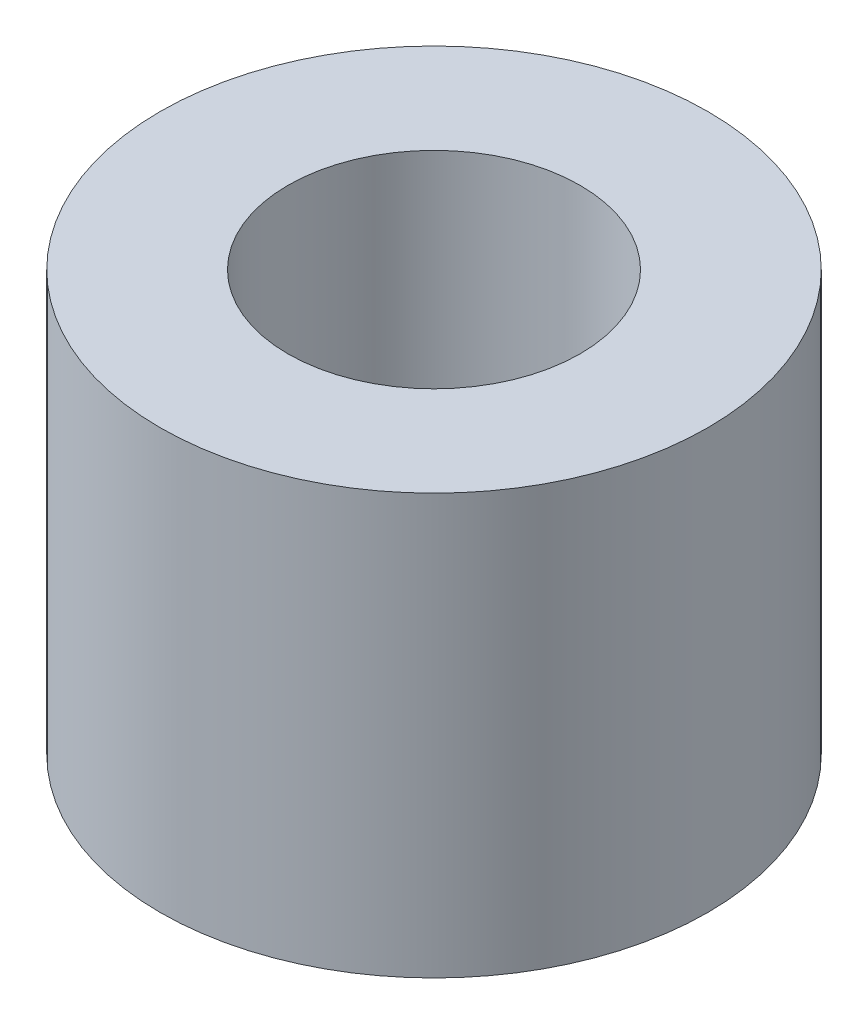
ISO-10303-21;
HEADER;
FILE_DESCRIPTION(('STEP AP214'),'2;1');
FILE_NAME('part.step','',(''),(''),'','','');
FILE_SCHEMA(('AUTOMOTIVE_DESIGN { 1 0 10303 214 1 1 1 1 }'));
ENDSEC;
DATA;
#1=APPLICATION_CONTEXT('core data for automotive mechanical design processes');
#2=APPLICATION_PROTOCOL_DEFINITION('international standard','automotive_design',2000,#1);
#3=PRODUCT_CONTEXT('',#1,'mechanical');
#4=PRODUCT('Part','Part','',(#3));
#5=PRODUCT_RELATED_PRODUCT_CATEGORY('part','',(#4));
#6=PRODUCT_DEFINITION_FORMATION('','',#4);
#7=PRODUCT_DEFINITION_CONTEXT('part definition',#1,'design');
#8=PRODUCT_DEFINITION('design','',#6,#7);
#9=PRODUCT_DEFINITION_SHAPE('','',#8);
#10=(LENGTH_UNIT() NAMED_UNIT(*) SI_UNIT(.MILLI.,.METRE.));
#11=(NAMED_UNIT(*) PLANE_ANGLE_UNIT() SI_UNIT($,.RADIAN.));
#12=(NAMED_UNIT(*) SI_UNIT($,.STERADIAN.) SOLID_ANGLE_UNIT());
#13=UNCERTAINTY_MEASURE_WITH_UNIT(LENGTH_MEASURE(1.E-05),#10,'distance_accuracy_value','');
#14=(GEOMETRIC_REPRESENTATION_CONTEXT(3) GLOBAL_UNCERTAINTY_ASSIGNED_CONTEXT((#13)) GLOBAL_UNIT_ASSIGNED_CONTEXT((#10,
#11,#12)) REPRESENTATION_CONTEXT('',''));
#15=CARTESIAN_POINT('',(0.,0.,0.));
#16=DIRECTION('',(0.,0.,1.));
#17=DIRECTION('',(1.,0.,0.));
#18=AXIS2_PLACEMENT_3D('',#15,#16,#17);
#19=CARTESIAN_POINT('',(0.,4.6,0.));
#20=DIRECTION('',(0.,-1.,0.));
#21=DIRECTION('',(0.,0.,-1.));
#22=AXIS2_PLACEMENT_3D('',#19,#20,#21);
#23=CYLINDRICAL_SURFACE('',#22,3.);
#24=CARTESIAN_POINT('',(0.,4.6,0.));
#25=DIRECTION('',(0.,-1.,0.));
#26=DIRECTION('',(0.,0.,-1.));
#27=AXIS2_PLACEMENT_3D('',#24,#25,#26);
#28=CIRCLE('',#27,3.);
#29=CARTESIAN_POINT('',(0.,4.6,-3.));
#30=VERTEX_POINT('',#29);
#31=EDGE_CURVE('E10',#30,#30,#28,.T.);
#32=ORIENTED_EDGE('',*,*,#31,.T.);
#33=EDGE_LOOP('',(#32));
#34=FACE_BOUND('',#33,.T.);
#35=CARTESIAN_POINT('',(0.,0.,0.));
#36=DIRECTION('',(0.,-1.,0.));
#37=DIRECTION('',(0.,0.,-1.));
#38=AXIS2_PLACEMENT_3D('',#35,#36,#37);
#39=CIRCLE('',#38,3.);
#40=CARTESIAN_POINT('',(0.,0.,-3.));
#41=VERTEX_POINT('',#40);
#42=EDGE_CURVE('E43',#41,#41,#39,.T.);
#43=ORIENTED_EDGE('',*,*,#42,.F.);
#44=EDGE_LOOP('',(#43));
#45=FACE_BOUND('',#44,.T.);
#46=ADVANCED_FACE('F40',(#34,#45),#23,.T.);
#47=CARTESIAN_POINT('',(0.,4.6,0.));
#48=DIRECTION('',(0.,-1.,0.));
#49=DIRECTION('',(0.,0.,-1.));
#50=AXIS2_PLACEMENT_3D('',#47,#48,#49);
#51=PLANE('',#50);
#52=CARTESIAN_POINT('',(0.,4.6,0.));
#53=DIRECTION('',(0.,-1.,0.));
#54=DIRECTION('',(0.,0.,-1.));
#55=AXIS2_PLACEMENT_3D('',#52,#53,#54);
#56=CIRCLE('',#55,1.6);
#57=CARTESIAN_POINT('',(0.,4.6,-1.6));
#58=VERTEX_POINT('',#57);
#59=EDGE_CURVE('E50',#58,#58,#56,.T.);
#60=ORIENTED_EDGE('',*,*,#59,.T.);
#61=EDGE_LOOP('',(#60));
#62=FACE_BOUND('',#61,.T.);
#63=ORIENTED_EDGE('',*,*,#31,.F.);
#64=EDGE_LOOP('',(#63));
#65=FACE_BOUND('',#64,.T.);
#66=ADVANCED_FACE('F58',(#62,#65),#51,.F.);
#67=CARTESIAN_POINT('',(0.,0.,0.));
#68=DIRECTION('',(0.,-1.,0.));
#69=DIRECTION('',(0.,0.,-1.));
#70=AXIS2_PLACEMENT_3D('',#67,#68,#69);
#71=PLANE('',#70);
#72=CARTESIAN_POINT('',(0.,0.,0.));
#73=DIRECTION('',(0.,-1.,0.));
#74=DIRECTION('',(0.,0.,-1.));
#75=AXIS2_PLACEMENT_3D('',#72,#73,#74);
#76=CIRCLE('',#75,1.6);
#77=CARTESIAN_POINT('',(0.,0.,-1.6));
#78=VERTEX_POINT('',#77);
#79=EDGE_CURVE('E52',#78,#78,#76,.T.);
#80=ORIENTED_EDGE('',*,*,#79,.F.);
#81=EDGE_LOOP('',(#80));
#82=FACE_BOUND('',#81,.T.);
#83=ORIENTED_EDGE('',*,*,#42,.T.);
#84=EDGE_LOOP('',(#83));
#85=FACE_BOUND('',#84,.T.);
#86=ADVANCED_FACE('F64',(#82,#85),#71,.T.);
#87=CARTESIAN_POINT('',(0.,4.6,0.));
#88=DIRECTION('',(0.,-1.,0.));
#89=DIRECTION('',(0.,0.,-1.));
#90=AXIS2_PLACEMENT_3D('',#87,#88,#89);
#91=CYLINDRICAL_SURFACE('',#90,1.6);
#92=ORIENTED_EDGE('',*,*,#59,.F.);
#93=EDGE_LOOP('',(#92));
#94=FACE_BOUND('',#93,.T.);
#95=ORIENTED_EDGE('',*,*,#79,.T.);
#96=EDGE_LOOP('',(#95));
#97=FACE_BOUND('',#96,.T.);
#98=ADVANCED_FACE('F61',(#94,#97),#91,.F.);
#99=CLOSED_SHELL('',(#46,#66,#86,#98));
#100=MANIFOLD_SOLID_BREP('B2',#99);
#101=ADVANCED_BREP_SHAPE_REPRESENTATION('',(#18,#100),#14);
#102=SHAPE_DEFINITION_REPRESENTATION(#9,#101);
ENDSEC;
END-ISO-10303-21;
